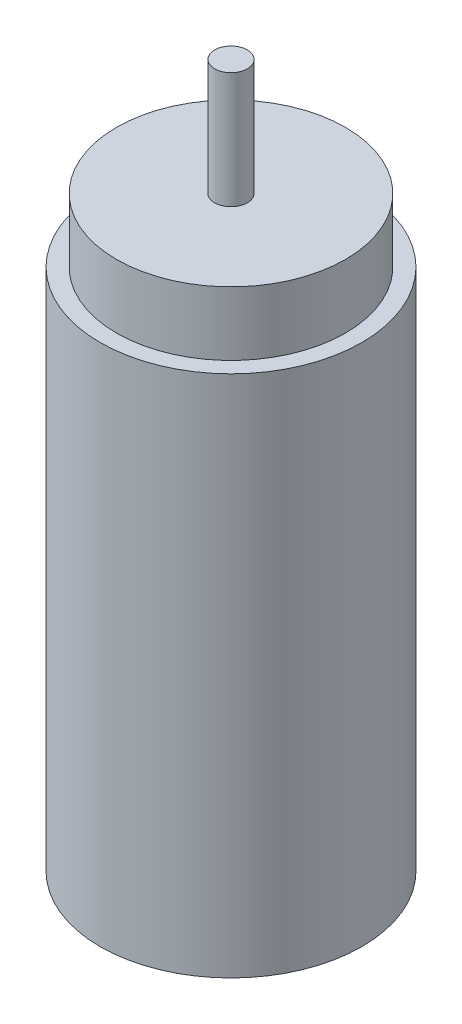
ISO-10303-21;
HEADER;
FILE_DESCRIPTION(('STEP AP214'),'2;1');
FILE_NAME('part.step','',(''),(''),'','','');
FILE_SCHEMA(('AUTOMOTIVE_DESIGN { 1 0 10303 214 1 1 1 1 }'));
ENDSEC;
DATA;
#1=APPLICATION_CONTEXT('core data for automotive mechanical design processes');
#2=APPLICATION_PROTOCOL_DEFINITION('international standard','automotive_design',2000,#1);
#3=PRODUCT_CONTEXT('',#1,'mechanical');
#4=PRODUCT('Part','Part','',(#3));
#5=PRODUCT_RELATED_PRODUCT_CATEGORY('part','',(#4));
#6=PRODUCT_DEFINITION_FORMATION('','',#4);
#7=PRODUCT_DEFINITION_CONTEXT('part definition',#1,'design');
#8=PRODUCT_DEFINITION('design','',#6,#7);
#9=PRODUCT_DEFINITION_SHAPE('','',#8);
#10=(LENGTH_UNIT() NAMED_UNIT(*) SI_UNIT(.MILLI.,.METRE.));
#11=(NAMED_UNIT(*) PLANE_ANGLE_UNIT() SI_UNIT($,.RADIAN.));
#12=(NAMED_UNIT(*) SI_UNIT($,.STERADIAN.) SOLID_ANGLE_UNIT());
#13=UNCERTAINTY_MEASURE_WITH_UNIT(LENGTH_MEASURE(1.E-05),#10,'distance_accuracy_value','');
#14=(GEOMETRIC_REPRESENTATION_CONTEXT(3) GLOBAL_UNCERTAINTY_ASSIGNED_CONTEXT((#13)) GLOBAL_UNIT_ASSIGNED_CONTEXT((#10,
#11,#12)) REPRESENTATION_CONTEXT('',''));
#15=CARTESIAN_POINT('',(0.,0.,0.));
#16=DIRECTION('',(0.,0.,1.));
#17=DIRECTION('',(1.,0.,0.));
#18=AXIS2_PLACEMENT_3D('',#15,#16,#17);
#19=CARTESIAN_POINT('',(0.,16.,0.));
#20=DIRECTION('',(0.,-1.,0.));
#21=DIRECTION('',(0.,0.,-1.));
#22=AXIS2_PLACEMENT_3D('',#19,#20,#21);
#23=CYLINDRICAL_SURFACE('',#22,4.);
#24=CARTESIAN_POINT('',(0.,16.,0.));
#25=DIRECTION('',(0.,1.,0.));
#26=DIRECTION('',(0.,0.,1.));
#27=AXIS2_PLACEMENT_3D('',#24,#25,#26);
#28=CIRCLE('',#27,4.);
#29=CARTESIAN_POINT('',(0.,16.,4.));
#30=VERTEX_POINT('',#29);
#31=EDGE_CURVE('E41',#30,#30,#28,.T.);
#32=ORIENTED_EDGE('',*,*,#31,.F.);
#33=EDGE_LOOP('',(#32));
#34=FACE_BOUND('',#33,.T.);
#35=CARTESIAN_POINT('',(0.,0.,0.));
#36=DIRECTION('',(0.,1.,0.));
#37=DIRECTION('',(0.,0.,1.));
#38=AXIS2_PLACEMENT_3D('',#35,#36,#37);
#39=CIRCLE('',#38,4.);
#40=CARTESIAN_POINT('',(0.,0.,4.));
#41=VERTEX_POINT('',#40);
#42=EDGE_CURVE('E46',#41,#41,#39,.T.);
#43=ORIENTED_EDGE('',*,*,#42,.T.);
#44=EDGE_LOOP('',(#43));
#45=FACE_BOUND('',#44,.T.);
#46=ADVANCED_FACE('F34',(#34,#45),#23,.T.);
#47=CARTESIAN_POINT('',(0.,16.,0.));
#48=DIRECTION('',(0.,1.,0.));
#49=DIRECTION('',(0.,0.,1.));
#50=AXIS2_PLACEMENT_3D('',#47,#48,#49);
#51=PLANE('',#50);
#52=CARTESIAN_POINT('',(0.,16.,0.));
#53=DIRECTION('',(0.,1.,0.));
#54=DIRECTION('',(0.,0.,1.));
#55=AXIS2_PLACEMENT_3D('',#52,#53,#54);
#56=CIRCLE('',#55,3.5);
#57=CARTESIAN_POINT('',(0.,16.,3.5));
#58=VERTEX_POINT('',#57);
#59=EDGE_CURVE('E10',#58,#58,#56,.T.);
#60=ORIENTED_EDGE('',*,*,#59,.F.);
#61=EDGE_LOOP('',(#60));
#62=FACE_BOUND('',#61,.T.);
#63=ORIENTED_EDGE('',*,*,#31,.T.);
#64=EDGE_LOOP('',(#63));
#65=FACE_BOUND('',#64,.T.);
#66=ADVANCED_FACE('F79',(#62,#65),#51,.T.);
#67=CARTESIAN_POINT('',(0.,0.,0.));
#68=DIRECTION('',(0.,1.,0.));
#69=DIRECTION('',(0.,0.,1.));
#70=AXIS2_PLACEMENT_3D('',#67,#68,#69);
#71=PLANE('',#70);
#72=ORIENTED_EDGE('',*,*,#42,.F.);
#73=EDGE_LOOP('',(#72));
#74=FACE_BOUND('',#73,.T.);
#75=ADVANCED_FACE('F84',(#74),#71,.F.);
#76=CARTESIAN_POINT('',(0.,17.95,0.));
#77=DIRECTION('',(0.,-1.,0.));
#78=DIRECTION('',(0.,0.,-1.));
#79=AXIS2_PLACEMENT_3D('',#76,#77,#78);
#80=CYLINDRICAL_SURFACE('',#79,3.5);
#81=CARTESIAN_POINT('',(0.,17.95,0.));
#82=DIRECTION('',(0.,1.,0.));
#83=DIRECTION('',(0.,0.,1.));
#84=AXIS2_PLACEMENT_3D('',#81,#82,#83);
#85=CIRCLE('',#84,3.5);
#86=CARTESIAN_POINT('',(0.,17.95,3.5));
#87=VERTEX_POINT('',#86);
#88=EDGE_CURVE('E49',#87,#87,#85,.T.);
#89=ORIENTED_EDGE('',*,*,#88,.F.);
#90=EDGE_LOOP('',(#89));
#91=FACE_BOUND('',#90,.T.);
#92=ORIENTED_EDGE('',*,*,#59,.T.);
#93=EDGE_LOOP('',(#92));
#94=FACE_BOUND('',#93,.T.);
#95=ADVANCED_FACE('F76',(#91,#94),#80,.T.);
#96=CARTESIAN_POINT('',(0.,17.95,0.));
#97=DIRECTION('',(0.,1.,0.));
#98=DIRECTION('',(0.,0.,1.));
#99=AXIS2_PLACEMENT_3D('',#96,#97,#98);
#100=PLANE('',#99);
#101=CARTESIAN_POINT('',(0.,17.95,0.));
#102=DIRECTION('',(0.,1.,0.));
#103=DIRECTION('',(0.,0.,1.));
#104=AXIS2_PLACEMENT_3D('',#101,#102,#103);
#105=CIRCLE('',#104,0.5);
#106=CARTESIAN_POINT('',(0.,17.95,0.5));
#107=VERTEX_POINT('',#106);
#108=EDGE_CURVE('E37',#107,#107,#105,.F.);
#109=ORIENTED_EDGE('',*,*,#108,.T.);
#110=EDGE_LOOP('',(#109));
#111=FACE_BOUND('',#110,.T.);
#112=ORIENTED_EDGE('',*,*,#88,.T.);
#113=EDGE_LOOP('',(#112));
#114=FACE_BOUND('',#113,.T.);
#115=ADVANCED_FACE('F68',(#111,#114),#100,.T.);
#116=CARTESIAN_POINT('',(0.,21.5,0.));
#117=DIRECTION('',(0.,-1.,0.));
#118=DIRECTION('',(0.,0.,-1.));
#119=AXIS2_PLACEMENT_3D('',#116,#117,#118);
#120=CYLINDRICAL_SURFACE('',#119,0.5);
#121=ORIENTED_EDGE('',*,*,#108,.F.);
#122=EDGE_LOOP('',(#121));
#123=FACE_BOUND('',#122,.T.);
#124=CARTESIAN_POINT('',(0.,21.5,0.));
#125=DIRECTION('',(0.,1.,0.));
#126=DIRECTION('',(0.,0.,1.));
#127=AXIS2_PLACEMENT_3D('',#124,#125,#126);
#128=CIRCLE('',#127,0.5);
#129=CARTESIAN_POINT('',(0.,21.5,0.5));
#130=VERTEX_POINT('',#129);
#131=EDGE_CURVE('E58',#130,#130,#128,.T.);
#132=ORIENTED_EDGE('',*,*,#131,.F.);
#133=EDGE_LOOP('',(#132));
#134=FACE_BOUND('',#133,.T.);
#135=ADVANCED_FACE('F66',(#123,#134),#120,.T.);
#136=CARTESIAN_POINT('',(0.,21.5,0.));
#137=DIRECTION('',(0.,1.,0.));
#138=DIRECTION('',(0.,0.,1.));
#139=AXIS2_PLACEMENT_3D('',#136,#137,#138);
#140=PLANE('',#139);
#141=ORIENTED_EDGE('',*,*,#131,.T.);
#142=EDGE_LOOP('',(#141));
#143=FACE_BOUND('',#142,.T.);
#144=ADVANCED_FACE('F64',(#143),#140,.T.);
#145=CLOSED_SHELL('',(#46,#66,#75,#95,#115,#135,#144));
#146=MANIFOLD_SOLID_BREP('B2',#145);
#147=ADVANCED_BREP_SHAPE_REPRESENTATION('',(#18,#146),#14);
#148=SHAPE_DEFINITION_REPRESENTATION(#9,#147);
ENDSEC;
END-ISO-10303-21;
